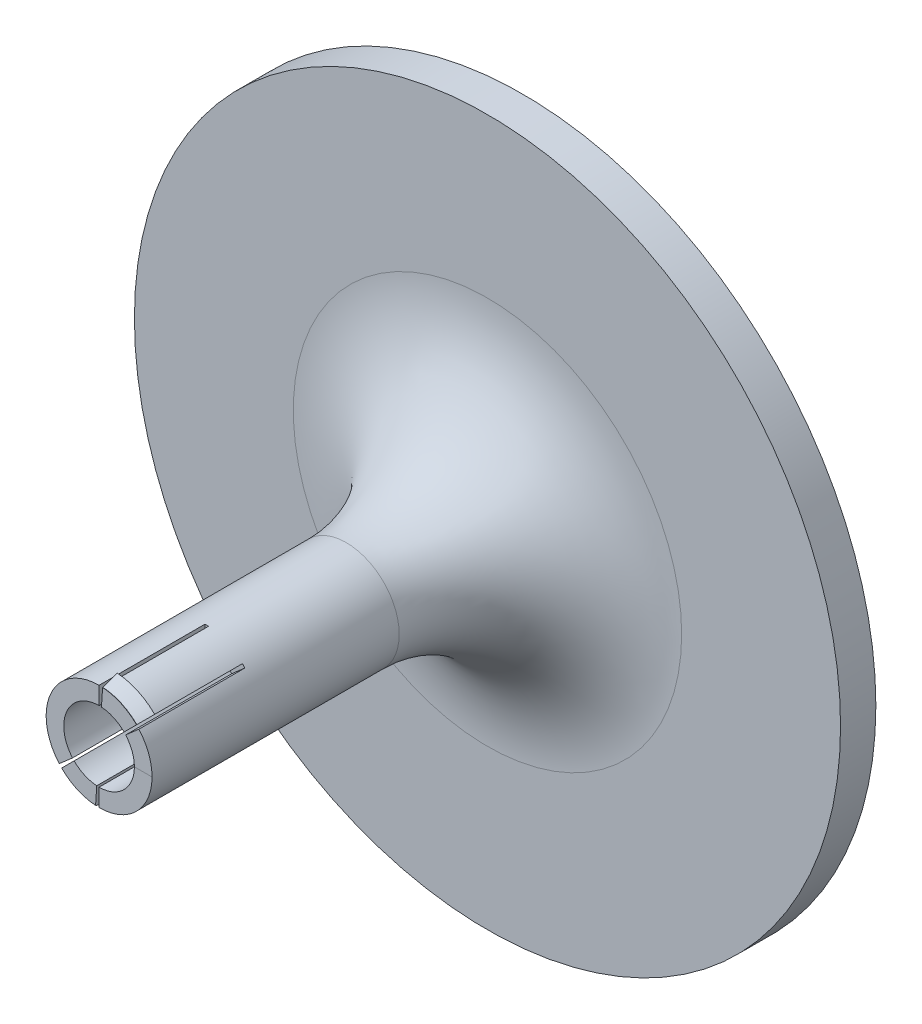
ISO-10303-21;
HEADER;
FILE_DESCRIPTION(('STEP AP214'),'2;1');
FILE_NAME('part.step','',(''),(''),'','','');
FILE_SCHEMA(('AUTOMOTIVE_DESIGN { 1 0 10303 214 1 1 1 1 }'));
ENDSEC;
DATA;
#1=APPLICATION_CONTEXT('core data for automotive mechanical design processes');
#2=APPLICATION_PROTOCOL_DEFINITION('international standard','automotive_design',2000,#1);
#3=PRODUCT_CONTEXT('',#1,'mechanical');
#4=PRODUCT('Part','Part','',(#3));
#5=PRODUCT_RELATED_PRODUCT_CATEGORY('part','',(#4));
#6=PRODUCT_DEFINITION_FORMATION('','',#4);
#7=PRODUCT_DEFINITION_CONTEXT('part definition',#1,'design');
#8=PRODUCT_DEFINITION('design','',#6,#7);
#9=PRODUCT_DEFINITION_SHAPE('','',#8);
#10=(LENGTH_UNIT() NAMED_UNIT(*) SI_UNIT(.MILLI.,.METRE.));
#11=(NAMED_UNIT(*) PLANE_ANGLE_UNIT() SI_UNIT($,.RADIAN.));
#12=(NAMED_UNIT(*) SI_UNIT($,.STERADIAN.) SOLID_ANGLE_UNIT());
#13=UNCERTAINTY_MEASURE_WITH_UNIT(LENGTH_MEASURE(1.E-05),#10,'distance_accuracy_value','');
#14=(GEOMETRIC_REPRESENTATION_CONTEXT(3) GLOBAL_UNCERTAINTY_ASSIGNED_CONTEXT((#13)) GLOBAL_UNIT_ASSIGNED_CONTEXT((#10,
#11,#12)) REPRESENTATION_CONTEXT('',''));
#15=CARTESIAN_POINT('',(0.,0.,0.));
#16=DIRECTION('',(0.,0.,1.));
#17=DIRECTION('',(1.,0.,0.));
#18=AXIS2_PLACEMENT_3D('',#15,#16,#17);
#19=CARTESIAN_POINT('',(0.,0.,0.));
#20=DIRECTION('',(0.,0.,1.));
#21=DIRECTION('',(1.,0.,0.));
#22=AXIS2_PLACEMENT_3D('',#19,#20,#21);
#23=CYLINDRICAL_SURFACE('',#22,7.5);
#24=CARTESIAN_POINT('',(0.,0.,-0.0406821281591772));
#25=DIRECTION('',(0.,0.,-1.));
#26=DIRECTION('',(-1.,0.,0.));
#27=AXIS2_PLACEMENT_3D('',#24,#25,#26);
#28=CIRCLE('',#27,7.5);
#29=CARTESIAN_POINT('',(0.498892578928304,7.48338868392456,-0.0406821281591772));
#30=VERTEX_POINT('',#29);
#31=CARTESIAN_POINT('',(5.3033008588991,5.30330085889912,-0.0406821281591779));
#32=VERTEX_POINT('',#31);
#33=EDGE_CURVE('E250',#30,#32,#28,.T.);
#34=ORIENTED_EDGE('',*,*,#33,.F.);
#35=DIRECTION('',(0.,0.,1.));
#36=VECTOR('',#35,1.);
#37=CARTESIAN_POINT('',(0.498892578928304,7.48338868392456,0.));
#38=LINE('',#37,#36);
#39=CARTESIAN_POINT('',(0.498892578928304,7.48338868392456,0.));
#40=VERTEX_POINT('',#39);
#41=EDGE_CURVE('E306',#40,#30,#38,.F.);
#42=ORIENTED_EDGE('',*,*,#41,.F.);
#43=CARTESIAN_POINT('',(0.,0.,0.));
#44=DIRECTION('',(0.,0.,1.));
#45=DIRECTION('',(1.,0.,0.));
#46=AXIS2_PLACEMENT_3D('',#43,#44,#45);
#47=CIRCLE('',#46,7.5);
#48=CARTESIAN_POINT('',(5.3033008588991,5.30330085889912,0.));
#49=VERTEX_POINT('',#48);
#50=EDGE_CURVE('E329',#49,#40,#47,.T.);
#51=ORIENTED_EDGE('',*,*,#50,.F.);
#52=DIRECTION('',(0.,0.,1.));
#53=VECTOR('',#52,1.);
#54=CARTESIAN_POINT('',(5.3033008588991,5.30330085889912,-15.));
#55=LINE('',#54,#53);
#56=EDGE_CURVE('E61',#32,#49,#55,.T.);
#57=ORIENTED_EDGE('',*,*,#56,.F.);
#58=EDGE_LOOP('',(#34,#42,#51,#57));
#59=FACE_BOUND('',#58,.T.);
#60=ADVANCED_FACE('F38',(#59),#23,.T.);
#61=CARTESIAN_POINT('',(0.,0.,0.));
#62=DIRECTION('',(0.,0.,1.));
#63=DIRECTION('',(1.,0.,0.));
#64=AXIS2_PLACEMENT_3D('',#61,#62,#63);
#65=PLANE('',#64);
#66=DIRECTION('',(-0.752576694706878,-0.658504607868518,0.));
#67=VECTOR('',#66,1.);
#68=CARTESIAN_POINT('',(0.,0.,0.));
#69=LINE('',#68,#67);
#70=CARTESIAN_POINT('',(-3.76288347353439,-3.29252303934259,0.));
#71=VERTEX_POINT('',#70);
#72=CARTESIAN_POINT('',(-5.64432521030158,-4.93878455901388,0.));
#73=VERTEX_POINT('',#72);
#74=EDGE_CURVE('E252',#71,#73,#69,.T.);
#75=ORIENTED_EDGE('',*,*,#74,.F.);
#76=CARTESIAN_POINT('',(0.,0.,0.));
#77=DIRECTION('',(0.,0.,1.));
#78=DIRECTION('',(1.,0.,0.));
#79=AXIS2_PLACEMENT_3D('',#76,#77,#78);
#80=CIRCLE('',#79,5.);
#81=CARTESIAN_POINT('',(0.,5.,0.));
#82=VERTEX_POINT('',#81);
#83=EDGE_CURVE('E319',#82,#71,#80,.T.);
#84=ORIENTED_EDGE('',*,*,#83,.F.);
#85=DIRECTION('',(0.,-1.,0.));
#86=VECTOR('',#85,1.);
#87=CARTESIAN_POINT('',(0.,0.,0.));
#88=LINE('',#87,#86);
#89=CARTESIAN_POINT('',(0.,7.5,0.));
#90=VERTEX_POINT('',#89);
#91=EDGE_CURVE('E292',#90,#82,#88,.T.);
#92=ORIENTED_EDGE('',*,*,#91,.F.);
#93=EDGE_CURVE('E331',#90,#73,#47,.T.);
#94=ORIENTED_EDGE('',*,*,#93,.T.);
#95=EDGE_LOOP('',(#75,#84,#92,#94));
#96=FACE_BOUND('',#95,.T.);
#97=ADVANCED_FACE('F430',(#96),#65,.T.);
#98=DIRECTION('',(0.707106781186546,0.707106781186549,0.));
#99=VECTOR('',#98,1.);
#100=CARTESIAN_POINT('',(0.,0.,0.));
#101=LINE('',#100,#99);
#102=CARTESIAN_POINT('',(-5.30330085889909,-5.30330085889911,0.));
#103=VERTEX_POINT('',#102);
#104=CARTESIAN_POINT('',(-3.53553390593273,-3.53553390593274,0.));
#105=VERTEX_POINT('',#104);
#106=EDGE_CURVE('E256',#103,#105,#101,.T.);
#107=ORIENTED_EDGE('',*,*,#106,.F.);
#108=CARTESIAN_POINT('',(-0.498892578928302,-7.48338868392456,0.));
#109=VERTEX_POINT('',#108);
#110=EDGE_CURVE('E330',#103,#109,#47,.T.);
#111=ORIENTED_EDGE('',*,*,#110,.T.);
#112=DIRECTION('',(-0.0665190105237739,-0.997785157856609,0.));
#113=VECTOR('',#112,1.);
#114=CARTESIAN_POINT('',(0.,0.,0.));
#115=LINE('',#114,#113);
#116=CARTESIAN_POINT('',(-0.33259505261887,-4.98892578928305,0.));
#117=VERTEX_POINT('',#116);
#118=EDGE_CURVE('E265',#117,#109,#115,.T.);
#119=ORIENTED_EDGE('',*,*,#118,.F.);
#120=EDGE_CURVE('E318',#105,#117,#80,.T.);
#121=ORIENTED_EDGE('',*,*,#120,.F.);
#122=EDGE_LOOP('',(#107,#111,#119,#121));
#123=FACE_BOUND('',#122,.T.);
#124=ADVANCED_FACE('F392',(#123),#65,.T.);
#125=DIRECTION('',(0.752576694706878,0.658504607868518,0.));
#126=VECTOR('',#125,1.);
#127=CARTESIAN_POINT('',(0.,0.,0.));
#128=LINE('',#127,#126);
#129=CARTESIAN_POINT('',(3.76288347353439,3.29252303934259,0.));
#130=VERTEX_POINT('',#129);
#131=CARTESIAN_POINT('',(5.64432521030158,4.93878455901389,0.));
#132=VERTEX_POINT('',#131);
#133=EDGE_CURVE('E275',#130,#132,#128,.T.);
#134=ORIENTED_EDGE('',*,*,#133,.F.);
#135=CARTESIAN_POINT('',(5.,0.,0.));
#136=VERTEX_POINT('',#135);
#137=EDGE_CURVE('E314',#136,#130,#80,.T.);
#138=ORIENTED_EDGE('',*,*,#137,.F.);
#139=DIRECTION('',(1.,0.,0.));
#140=VECTOR('',#139,1.);
#141=CARTESIAN_POINT('',(0.,0.,0.));
#142=LINE('',#141,#140);
#143=CARTESIAN_POINT('',(7.5,0.,0.));
#144=VERTEX_POINT('',#143);
#145=EDGE_CURVE('E349',#136,#144,#142,.T.);
#146=ORIENTED_EDGE('',*,*,#145,.T.);
#147=EDGE_CURVE('E326',#144,#132,#47,.T.);
#148=ORIENTED_EDGE('',*,*,#147,.T.);
#149=EDGE_LOOP('',(#134,#138,#146,#148));
#150=FACE_BOUND('',#149,.T.);
#151=ADVANCED_FACE('F451',(#150),#65,.T.);
#152=DIRECTION('',(0.,1.,0.));
#153=VECTOR('',#152,1.);
#154=CARTESIAN_POINT('',(0.,0.,0.));
#155=LINE('',#154,#153);
#156=CARTESIAN_POINT('',(0.,-7.5,0.));
#157=VERTEX_POINT('',#156);
#158=CARTESIAN_POINT('',(0.,-5.,0.));
#159=VERTEX_POINT('',#158);
#160=EDGE_CURVE('E270',#157,#159,#155,.T.);
#161=ORIENTED_EDGE('',*,*,#160,.F.);
#162=EDGE_CURVE('E352',#157,#144,#47,.T.);
#163=ORIENTED_EDGE('',*,*,#162,.T.);
#164=ORIENTED_EDGE('',*,*,#145,.F.);
#165=EDGE_CURVE('E309',#159,#136,#80,.T.);
#166=ORIENTED_EDGE('',*,*,#165,.F.);
#167=EDGE_LOOP('',(#161,#163,#164,#166));
#168=FACE_BOUND('',#167,.T.);
#169=ADVANCED_FACE('F446',(#168),#65,.T.);
#170=CARTESIAN_POINT('',(0.,0.,-2.));
#171=DIRECTION('',(0.,0.,1.));
#172=DIRECTION('',(-0.707106781186547,-0.707106781186548,0.));
#173=AXIS2_PLACEMENT_3D('',#170,#171,#172);
#174=CIRCLE('',#173,7.5);
#175=CARTESIAN_POINT('',(-5.30330085889909,-5.30330085889911,-2.));
#176=VERTEX_POINT('',#175);
#177=CARTESIAN_POINT('',(-0.498892578928304,-7.48338868392456,-2.));
#178=VERTEX_POINT('',#177);
#179=EDGE_CURVE('E53',#176,#178,#174,.T.);
#180=ORIENTED_EDGE('',*,*,#179,.F.);
#181=DIRECTION('',(0.,0.,1.));
#182=VECTOR('',#181,1.);
#183=CARTESIAN_POINT('',(-5.30330085889909,-5.30330085889911,-15.));
#184=LINE('',#183,#182);
#185=CARTESIAN_POINT('',(-5.30330085889909,-5.30330085889911,-15.));
#186=VERTEX_POINT('',#185);
#187=EDGE_CURVE('E263',#186,#176,#184,.T.);
#188=ORIENTED_EDGE('',*,*,#187,.F.);
#189=CARTESIAN_POINT('',(0.,0.,-15.));
#190=DIRECTION('',(0.,0.,1.));
#191=DIRECTION('',(1.,0.,0.));
#192=AXIS2_PLACEMENT_3D('',#189,#190,#191);
#193=CIRCLE('',#192,7.5);
#194=CARTESIAN_POINT('',(-5.64432521030158,-4.93878455901388,-15.));
#195=VERTEX_POINT('',#194);
#196=EDGE_CURVE('E255',#195,#186,#193,.T.);
#197=ORIENTED_EDGE('',*,*,#196,.F.);
#198=DIRECTION('',(0.,0.,1.));
#199=VECTOR('',#198,1.);
#200=CARTESIAN_POINT('',(-5.64432521030158,-4.93878455901388,-15.));
#201=LINE('',#200,#199);
#202=EDGE_CURVE('E260',#195,#73,#201,.T.);
#203=ORIENTED_EDGE('',*,*,#202,.T.);
#204=ORIENTED_EDGE('',*,*,#93,.F.);
#205=DIRECTION('',(0.,0.,1.));
#206=VECTOR('',#205,1.);
#207=CARTESIAN_POINT('',(0.,7.5,-15.));
#208=LINE('',#207,#206);
#209=CARTESIAN_POINT('',(0.,7.5,-15.));
#210=VERTEX_POINT('',#209);
#211=EDGE_CURVE('E299',#210,#90,#208,.T.);
#212=ORIENTED_EDGE('',*,*,#211,.F.);
#213=CARTESIAN_POINT('',(0.,0.,-15.));
#214=DIRECTION('',(0.,0.,-1.));
#215=DIRECTION('',(-1.,0.,0.));
#216=AXIS2_PLACEMENT_3D('',#213,#214,#215);
#217=CIRCLE('',#216,7.5);
#218=CARTESIAN_POINT('',(0.498892578928304,7.48338868392456,-15.));
#219=VERTEX_POINT('',#218);
#220=EDGE_CURVE('E303',#219,#210,#217,.F.);
#221=ORIENTED_EDGE('',*,*,#220,.F.);
#222=CARTESIAN_POINT('',(0.498892578928305,7.48338868392457,-1.99993101485482));
#223=VERTEX_POINT('',#222);
#224=EDGE_CURVE('E305',#223,#219,#38,.F.);
#225=ORIENTED_EDGE('',*,*,#224,.F.);
#226=CARTESIAN_POINT('',(0.,0.,-1.99993101485482));
#227=DIRECTION('',(0.,0.,1.));
#228=DIRECTION('',(0.707106781186546,0.707106781186549,0.));
#229=AXIS2_PLACEMENT_3D('',#226,#227,#228);
#230=CIRCLE('',#229,7.5);
#231=CARTESIAN_POINT('',(5.3033008588991,5.30330085889912,-1.99993101485482));
#232=VERTEX_POINT('',#231);
#233=EDGE_CURVE('E235',#232,#223,#230,.T.);
#234=ORIENTED_EDGE('',*,*,#233,.F.);
#235=CARTESIAN_POINT('',(5.3033008588991,5.30330085889912,-15.));
#236=VERTEX_POINT('',#235);
#237=EDGE_CURVE('E285',#236,#232,#55,.T.);
#238=ORIENTED_EDGE('',*,*,#237,.F.);
#239=CARTESIAN_POINT('',(0.,0.,-15.));
#240=DIRECTION('',(0.,0.,-1.));
#241=DIRECTION('',(-1.,0.,0.));
#242=AXIS2_PLACEMENT_3D('',#239,#240,#241);
#243=CIRCLE('',#242,7.5);
#244=CARTESIAN_POINT('',(5.64432521030158,4.93878455901388,-15.));
#245=VERTEX_POINT('',#244);
#246=EDGE_CURVE('E288',#245,#236,#243,.F.);
#247=ORIENTED_EDGE('',*,*,#246,.F.);
#248=DIRECTION('',(0.,0.,1.));
#249=VECTOR('',#248,1.);
#250=CARTESIAN_POINT('',(5.64432521030158,4.93878455901388,0.));
#251=LINE('',#250,#249);
#252=EDGE_CURVE('E290',#132,#245,#251,.F.);
#253=ORIENTED_EDGE('',*,*,#252,.F.);
#254=ORIENTED_EDGE('',*,*,#147,.F.);
#255=DIRECTION('',(0.,0.,-1.));
#256=VECTOR('',#255,1.);
#257=CARTESIAN_POINT('',(7.5,0.,-35.));
#258=LINE('',#257,#256);
#259=CARTESIAN_POINT('',(7.5,0.,-35.));
#260=VERTEX_POINT('',#259);
#261=EDGE_CURVE('E313',#144,#260,#258,.T.);
#262=ORIENTED_EDGE('',*,*,#261,.T.);
#263=CARTESIAN_POINT('',(0.,0.,-35.));
#264=DIRECTION('',(0.,0.,1.));
#265=DIRECTION('',(1.,0.,0.));
#266=AXIS2_PLACEMENT_3D('',#263,#264,#265);
#267=CIRCLE('',#266,7.5);
#268=EDGE_CURVE('E323',#260,#260,#267,.T.);
#269=ORIENTED_EDGE('',*,*,#268,.T.);
#270=ORIENTED_EDGE('',*,*,#261,.F.);
#271=ORIENTED_EDGE('',*,*,#162,.F.);
#272=DIRECTION('',(0.,0.,1.));
#273=VECTOR('',#272,1.);
#274=CARTESIAN_POINT('',(0.,-7.5,-15.));
#275=LINE('',#274,#273);
#276=CARTESIAN_POINT('',(0.,-7.5,-15.));
#277=VERTEX_POINT('',#276);
#278=EDGE_CURVE('E209',#277,#157,#275,.T.);
#279=ORIENTED_EDGE('',*,*,#278,.F.);
#280=CARTESIAN_POINT('',(0.,0.,-15.));
#281=DIRECTION('',(0.,0.,1.));
#282=DIRECTION('',(1.,0.,0.));
#283=AXIS2_PLACEMENT_3D('',#280,#281,#282);
#284=CIRCLE('',#283,7.5);
#285=CARTESIAN_POINT('',(-0.498892578928302,-7.48338868392456,-15.));
#286=VERTEX_POINT('',#285);
#287=EDGE_CURVE('E206',#286,#277,#284,.T.);
#288=ORIENTED_EDGE('',*,*,#287,.F.);
#289=DIRECTION('',(0.,0.,1.));
#290=VECTOR('',#289,1.);
#291=CARTESIAN_POINT('',(-0.498892578928302,-7.48338868392456,-15.));
#292=LINE('',#291,#290);
#293=EDGE_CURVE('E202',#286,#178,#292,.T.);
#294=ORIENTED_EDGE('',*,*,#293,.T.);
#295=EDGE_LOOP('',(#180,#188,#197,#203,#204,#212,#221,#225,#234,#238,#247,#253,#254,#262,#269,
#270,#271,#279,#288,#294));
#296=FACE_BOUND('',#295,.T.);
#297=ADVANCED_FACE('F204',(#296),#23,.T.);
#298=ORIENTED_EDGE('',*,*,#50,.T.);
#299=DIRECTION('',(0.0665190105237739,0.997785157856609,0.));
#300=VECTOR('',#299,1.);
#301=CARTESIAN_POINT('',(0.,0.,0.));
#302=LINE('',#301,#300);
#303=CARTESIAN_POINT('',(0.33259505261887,4.98892578928305,0.));
#304=VERTEX_POINT('',#303);
#305=EDGE_CURVE('E296',#304,#40,#302,.T.);
#306=ORIENTED_EDGE('',*,*,#305,.F.);
#307=CARTESIAN_POINT('',(3.53553390593273,3.53553390593274,0.));
#308=VERTEX_POINT('',#307);
#309=EDGE_CURVE('E317',#308,#304,#80,.T.);
#310=ORIENTED_EDGE('',*,*,#309,.F.);
#311=DIRECTION('',(-0.707106781186546,-0.707106781186549,0.));
#312=VECTOR('',#311,1.);
#313=CARTESIAN_POINT('',(0.,0.,0.));
#314=LINE('',#313,#312);
#315=EDGE_CURVE('E281',#49,#308,#314,.T.);
#316=ORIENTED_EDGE('',*,*,#315,.F.);
#317=EDGE_LOOP('',(#298,#306,#310,#316));
#318=FACE_BOUND('',#317,.T.);
#319=ADVANCED_FACE('F40',(#318),#65,.T.);
#320=CARTESIAN_POINT('',(0.,0.,-60.));
#321=DIRECTION('',(0.,0.,-1.));
#322=DIRECTION('',(-1.,0.,0.));
#323=AXIS2_PLACEMENT_3D('',#320,#321,#322);
#324=PLANE('',#323);
#325=CARTESIAN_POINT('',(0.,0.,-60.));
#326=DIRECTION('',(0.,0.,1.));
#327=DIRECTION('',(1.,0.,0.));
#328=AXIS2_PLACEMENT_3D('',#325,#326,#327);
#329=CIRCLE('',#328,5.);
#330=CARTESIAN_POINT('',(5.,0.,-60.));
#331=VERTEX_POINT('',#330);
#332=EDGE_CURVE('E310',#331,#331,#329,.T.);
#333=ORIENTED_EDGE('',*,*,#332,.T.);
#334=EDGE_LOOP('',(#333));
#335=FACE_BOUND('',#334,.T.);
#336=CARTESIAN_POINT('',(0.,0.,-60.));
#337=DIRECTION('',(0.,0.,1.));
#338=DIRECTION('',(1.,0.,0.));
#339=AXIS2_PLACEMENT_3D('',#336,#337,#338);
#340=CIRCLE('',#339,50.);
#341=CARTESIAN_POINT('',(50.,0.,-60.));
#342=VERTEX_POINT('',#341);
#343=EDGE_CURVE('E341',#342,#342,#340,.T.);
#344=ORIENTED_EDGE('',*,*,#343,.F.);
#345=EDGE_LOOP('',(#344));
#346=FACE_BOUND('',#345,.T.);
#347=ADVANCED_FACE('F469',(#335,#346),#324,.T.);
#348=CARTESIAN_POINT('',(0.,0.,0.));
#349=DIRECTION('',(0.,0.,1.));
#350=DIRECTION('',(1.,0.,0.));
#351=AXIS2_PLACEMENT_3D('',#348,#349,#350);
#352=CYLINDRICAL_SURFACE('',#351,50.);
#353=DIRECTION('',(0.,0.,-1.));
#354=VECTOR('',#353,1.);
#355=CARTESIAN_POINT('',(50.,0.,-60.));
#356=LINE('',#355,#354);
#357=CARTESIAN_POINT('',(50.,0.,-55.));
#358=VERTEX_POINT('',#357);
#359=EDGE_CURVE('E339',#358,#342,#356,.T.);
#360=ORIENTED_EDGE('',*,*,#359,.F.);
#361=CARTESIAN_POINT('',(0.,0.,-55.));
#362=DIRECTION('',(0.,0.,1.));
#363=DIRECTION('',(1.,0.,0.));
#364=AXIS2_PLACEMENT_3D('',#361,#362,#363);
#365=CIRCLE('',#364,50.);
#366=EDGE_CURVE('E336',#358,#358,#365,.T.);
#367=ORIENTED_EDGE('',*,*,#366,.F.);
#368=ORIENTED_EDGE('',*,*,#359,.T.);
#369=ORIENTED_EDGE('',*,*,#343,.T.);
#370=EDGE_LOOP('',(#360,#367,#368,#369));
#371=FACE_BOUND('',#370,.T.);
#372=ADVANCED_FACE('F465',(#371),#352,.T.);
#373=CARTESIAN_POINT('',(50.,0.,-55.));
#374=DIRECTION('',(0.,0.,1.));
#375=DIRECTION('',(1.,0.,0.));
#376=AXIS2_PLACEMENT_3D('',#373,#374,#375);
#377=PLANE('',#376);
#378=ORIENTED_EDGE('',*,*,#366,.T.);
#379=EDGE_LOOP('',(#378));
#380=FACE_BOUND('',#379,.T.);
#381=CARTESIAN_POINT('',(0.,0.,-55.));
#382=DIRECTION('',(0.,0.,1.));
#383=DIRECTION('',(1.,0.,0.));
#384=AXIS2_PLACEMENT_3D('',#381,#382,#383);
#385=CIRCLE('',#384,27.5);
#386=CARTESIAN_POINT('',(27.5,0.,-55.));
#387=VERTEX_POINT('',#386);
#388=EDGE_CURVE('E325',#387,#387,#385,.T.);
#389=ORIENTED_EDGE('',*,*,#388,.F.);
#390=EDGE_LOOP('',(#389));
#391=FACE_BOUND('',#390,.T.);
#392=ADVANCED_FACE('F461',(#380,#391),#377,.T.);
#393=CARTESIAN_POINT('',(0.,0.,-35.));
#394=DIRECTION('',(0.,0.,1.));
#395=DIRECTION('',(1.,0.,0.));
#396=AXIS2_PLACEMENT_3D('',#393,#394,#395);
#397=TOROIDAL_SURFACE('',#396,27.5,20.);
#398=CARTESIAN_POINT('',(27.5,0.,-35.));
#399=DIRECTION('',(0.,-1.,0.));
#400=DIRECTION('',(0.,0.,1.));
#401=AXIS2_PLACEMENT_3D('',#398,#399,#400);
#402=CIRCLE('',#401,20.);
#403=EDGE_CURVE('E322',#260,#387,#402,.T.);
#404=ORIENTED_EDGE('',*,*,#403,.F.);
#405=ORIENTED_EDGE('',*,*,#268,.F.);
#406=ORIENTED_EDGE('',*,*,#403,.T.);
#407=ORIENTED_EDGE('',*,*,#388,.T.);
#408=EDGE_LOOP('',(#404,#405,#406,#407));
#409=FACE_BOUND('',#408,.T.);
#410=ADVANCED_FACE('F457',(#409),#397,.F.);
#411=CARTESIAN_POINT('',(0.,0.,-60.));
#412=DIRECTION('',(0.,0.,1.));
#413=DIRECTION('',(1.,0.,0.));
#414=AXIS2_PLACEMENT_3D('',#411,#412,#413);
#415=CYLINDRICAL_SURFACE('',#414,5.);
#416=ORIENTED_EDGE('',*,*,#83,.T.);
#417=DIRECTION('',(0.,0.,1.));
#418=VECTOR('',#417,1.);
#419=CARTESIAN_POINT('',(-3.76288347353439,-3.29252303934259,-60.));
#420=LINE('',#419,#418);
#421=CARTESIAN_POINT('',(-3.76288347353439,-3.29252303934259,-15.));
#422=VERTEX_POINT('',#421);
#423=EDGE_CURVE('E11',#71,#422,#420,.F.);
#424=ORIENTED_EDGE('',*,*,#423,.T.);
#425=CARTESIAN_POINT('',(0.,0.,-15.));
#426=DIRECTION('',(0.,0.,1.));
#427=DIRECTION('',(1.,0.,0.));
#428=AXIS2_PLACEMENT_3D('',#425,#426,#427);
#429=CIRCLE('',#428,5.);
#430=CARTESIAN_POINT('',(-3.53553390593273,-3.53553390593274,-15.));
#431=VERTEX_POINT('',#430);
#432=EDGE_CURVE('E378',#431,#422,#429,.F.);
#433=ORIENTED_EDGE('',*,*,#432,.F.);
#434=DIRECTION('',(0.,0.,1.));
#435=VECTOR('',#434,1.);
#436=CARTESIAN_POINT('',(-3.53553390593273,-3.53553390593274,-60.));
#437=LINE('',#436,#435);
#438=EDGE_CURVE('E46',#431,#105,#437,.T.);
#439=ORIENTED_EDGE('',*,*,#438,.T.);
#440=ORIENTED_EDGE('',*,*,#120,.T.);
#441=DIRECTION('',(0.,0.,1.));
#442=VECTOR('',#441,1.);
#443=CARTESIAN_POINT('',(-0.33259505261887,-4.98892578928305,-60.));
#444=LINE('',#443,#442);
#445=CARTESIAN_POINT('',(-0.33259505261887,-4.98892578928305,-15.));
#446=VERTEX_POINT('',#445);
#447=EDGE_CURVE('E375',#117,#446,#444,.F.);
#448=ORIENTED_EDGE('',*,*,#447,.T.);
#449=CARTESIAN_POINT('',(0.,0.,-15.));
#450=DIRECTION('',(0.,0.,1.));
#451=DIRECTION('',(1.,0.,0.));
#452=AXIS2_PLACEMENT_3D('',#449,#450,#451);
#453=CIRCLE('',#452,5.);
#454=CARTESIAN_POINT('',(0.,-5.,-15.));
#455=VERTEX_POINT('',#454);
#456=EDGE_CURVE('E370',#455,#446,#453,.F.);
#457=ORIENTED_EDGE('',*,*,#456,.F.);
#458=DIRECTION('',(0.,0.,1.));
#459=VECTOR('',#458,1.);
#460=CARTESIAN_POINT('',(0.,-5.,-60.));
#461=LINE('',#460,#459);
#462=EDGE_CURVE('E372',#455,#159,#461,.T.);
#463=ORIENTED_EDGE('',*,*,#462,.T.);
#464=ORIENTED_EDGE('',*,*,#165,.T.);
#465=ORIENTED_EDGE('',*,*,#137,.T.);
#466=DIRECTION('',(0.,0.,1.));
#467=VECTOR('',#466,1.);
#468=CARTESIAN_POINT('',(3.76288347353439,3.29252303934259,-60.));
#469=LINE('',#468,#467);
#470=CARTESIAN_POINT('',(3.76288347353439,3.29252303934259,-15.));
#471=VERTEX_POINT('',#470);
#472=EDGE_CURVE('E367',#130,#471,#469,.F.);
#473=ORIENTED_EDGE('',*,*,#472,.T.);
#474=CARTESIAN_POINT('',(0.,0.,-15.));
#475=DIRECTION('',(0.,0.,-1.));
#476=DIRECTION('',(-1.,0.,0.));
#477=AXIS2_PLACEMENT_3D('',#474,#475,#476);
#478=CIRCLE('',#477,5.);
#479=CARTESIAN_POINT('',(3.53553390593273,3.53553390593274,-15.));
#480=VERTEX_POINT('',#479);
#481=EDGE_CURVE('E361',#471,#480,#478,.F.);
#482=ORIENTED_EDGE('',*,*,#481,.T.);
#483=DIRECTION('',(0.,0.,1.));
#484=VECTOR('',#483,1.);
#485=CARTESIAN_POINT('',(3.53553390593273,3.53553390593274,-60.));
#486=LINE('',#485,#484);
#487=EDGE_CURVE('E364',#480,#308,#486,.T.);
#488=ORIENTED_EDGE('',*,*,#487,.T.);
#489=ORIENTED_EDGE('',*,*,#309,.T.);
#490=DIRECTION('',(0.,0.,1.));
#491=VECTOR('',#490,1.);
#492=CARTESIAN_POINT('',(0.33259505261887,4.98892578928305,-60.));
#493=LINE('',#492,#491);
#494=CARTESIAN_POINT('',(0.33259505261887,4.98892578928305,-15.));
#495=VERTEX_POINT('',#494);
#496=EDGE_CURVE('E355',#304,#495,#493,.F.);
#497=ORIENTED_EDGE('',*,*,#496,.T.);
#498=CARTESIAN_POINT('',(0.,0.,-15.));
#499=DIRECTION('',(0.,0.,-1.));
#500=DIRECTION('',(-1.,0.,0.));
#501=AXIS2_PLACEMENT_3D('',#498,#499,#500);
#502=CIRCLE('',#501,5.);
#503=CARTESIAN_POINT('',(0.,5.,-15.));
#504=VERTEX_POINT('',#503);
#505=EDGE_CURVE('E346',#495,#504,#502,.F.);
#506=ORIENTED_EDGE('',*,*,#505,.T.);
#507=DIRECTION('',(0.,0.,1.));
#508=VECTOR('',#507,1.);
#509=CARTESIAN_POINT('',(0.,5.,-60.));
#510=LINE('',#509,#508);
#511=EDGE_CURVE('E358',#504,#82,#510,.T.);
#512=ORIENTED_EDGE('',*,*,#511,.T.);
#513=EDGE_LOOP('',(#416,#424,#433,#439,#440,#448,#457,#463,#464,#465,#473,#482,#488,#489,#497,
#506,#512));
#514=FACE_BOUND('',#513,.T.);
#515=ORIENTED_EDGE('',*,*,#332,.F.);
#516=EDGE_LOOP('',(#515));
#517=FACE_BOUND('',#516,.T.);
#518=ADVANCED_FACE('F385',(#514,#517),#415,.F.);
#519=CARTESIAN_POINT('',(0.,0.,-15.));
#520=DIRECTION('',(-1.,0.,0.));
#521=DIRECTION('',(0.,0.,1.));
#522=AXIS2_PLACEMENT_3D('',#519,#520,#521);
#523=PLANE('',#522);
#524=DIRECTION('',(0.,-1.,0.));
#525=VECTOR('',#524,1.);
#526=CARTESIAN_POINT('',(0.,0.,-15.));
#527=LINE('',#526,#525);
#528=EDGE_CURVE('E293',#210,#504,#527,.T.);
#529=ORIENTED_EDGE('',*,*,#528,.F.);
#530=ORIENTED_EDGE('',*,*,#211,.T.);
#531=ORIENTED_EDGE('',*,*,#91,.T.);
#532=ORIENTED_EDGE('',*,*,#511,.F.);
#533=EDGE_LOOP('',(#529,#530,#531,#532));
#534=FACE_BOUND('',#533,.T.);
#535=ADVANCED_FACE('F425',(#534),#523,.F.);
#536=CARTESIAN_POINT('',(0.,0.,-15.));
#537=DIRECTION('',(0.997785157856609,-0.0665190105237739,0.));
#538=DIRECTION('',(0.0665190105237739,0.997785157856609,0.));
#539=AXIS2_PLACEMENT_3D('',#536,#537,#538);
#540=PLANE('',#539);
#541=DIRECTION('',(-0.066519010523774,-0.997785157856609,0.));
#542=VECTOR('',#541,1.);
#543=CARTESIAN_POINT('',(0.498892578928305,7.48338868392457,-1.99993101485482));
#544=LINE('',#543,#542);
#545=CARTESIAN_POINT('',(0.552107787347324,8.28161681020985,-1.99993101485482));
#546=VERTEX_POINT('',#545);
#547=EDGE_CURVE('E245',#546,#223,#544,.T.);
#548=ORIENTED_EDGE('',*,*,#547,.T.);
#549=ORIENTED_EDGE('',*,*,#224,.T.);
#550=DIRECTION('',(0.0665190105237739,0.997785157856609,0.));
#551=VECTOR('',#550,1.);
#552=CARTESIAN_POINT('',(0.,0.,-15.));
#553=LINE('',#552,#551);
#554=EDGE_CURVE('E295',#495,#219,#553,.T.);
#555=ORIENTED_EDGE('',*,*,#554,.F.);
#556=ORIENTED_EDGE('',*,*,#496,.F.);
#557=ORIENTED_EDGE('',*,*,#305,.T.);
#558=ORIENTED_EDGE('',*,*,#41,.T.);
#559=DIRECTION('',(0.025145594318371,0.377183914775564,-0.92579695048156));
#560=VECTOR('',#559,1.);
#561=CARTESIAN_POINT('',(0.552107787347324,8.28161681020985,-1.99993101485482));
#562=LINE('',#561,#560);
#563=EDGE_CURVE('E238',#30,#546,#562,.T.);
#564=ORIENTED_EDGE('',*,*,#563,.T.);
#565=EDGE_LOOP('',(#548,#549,#555,#556,#557,#558,#564));
#566=FACE_BOUND('',#565,.T.);
#567=ADVANCED_FACE('F404',(#566),#540,.F.);
#568=CARTESIAN_POINT('',(0.,0.,-15.));
#569=DIRECTION('',(0.,0.,-1.));
#570=DIRECTION('',(-1.,0.,0.));
#571=AXIS2_PLACEMENT_3D('',#568,#569,#570);
#572=PLANE('',#571);
#573=ORIENTED_EDGE('',*,*,#220,.T.);
#574=ORIENTED_EDGE('',*,*,#528,.T.);
#575=ORIENTED_EDGE('',*,*,#505,.F.);
#576=ORIENTED_EDGE('',*,*,#554,.T.);
#577=EDGE_LOOP('',(#573,#574,#575,#576));
#578=FACE_BOUND('',#577,.T.);
#579=ADVANCED_FACE('F418',(#578),#572,.F.);
#580=CARTESIAN_POINT('',(0.,0.,-15.));
#581=DIRECTION('',(0.658504607868518,-0.752576694706878,0.));
#582=DIRECTION('',(0.752576694706878,0.658504607868518,0.));
#583=AXIS2_PLACEMENT_3D('',#580,#581,#582);
#584=PLANE('',#583);
#585=ORIENTED_EDGE('',*,*,#252,.T.);
#586=DIRECTION('',(0.752576694706878,0.658504607868518,0.));
#587=VECTOR('',#586,1.);
#588=CARTESIAN_POINT('',(0.,0.,-15.));
#589=LINE('',#588,#587);
#590=EDGE_CURVE('E277',#471,#245,#589,.T.);
#591=ORIENTED_EDGE('',*,*,#590,.F.);
#592=ORIENTED_EDGE('',*,*,#472,.F.);
#593=ORIENTED_EDGE('',*,*,#133,.T.);
#594=EDGE_LOOP('',(#585,#591,#592,#593));
#595=FACE_BOUND('',#594,.T.);
#596=ADVANCED_FACE('F565',(#595),#584,.F.);
#597=CARTESIAN_POINT('',(0.,0.,-15.));
#598=DIRECTION('',(-0.707106781186549,0.707106781186546,0.));
#599=DIRECTION('',(-0.707106781186546,-0.707106781186549,0.));
#600=AXIS2_PLACEMENT_3D('',#597,#598,#599);
#601=PLANE('',#600);
#602=ORIENTED_EDGE('',*,*,#237,.T.);
#603=DIRECTION('',(-0.707106781186546,-0.707106781186549,0.));
#604=VECTOR('',#603,1.);
#605=CARTESIAN_POINT('',(5.3033008588991,5.30330085889911,-1.99993101485482));
#606=LINE('',#605,#604);
#607=CARTESIAN_POINT('',(5.86898628384833,5.86898628384835,-1.99993101485482));
#608=VERTEX_POINT('',#607);
#609=EDGE_CURVE('E239',#608,#232,#606,.T.);
#610=ORIENTED_EDGE('',*,*,#609,.F.);
#611=DIRECTION('',(0.267301334152154,0.267301334152155,-0.92579695048156));
#612=VECTOR('',#611,1.);
#613=CARTESIAN_POINT('',(5.86898628384833,5.86898628384835,-1.99993101485482));
#614=LINE('',#613,#612);
#615=EDGE_CURVE('E221',#32,#608,#614,.T.);
#616=ORIENTED_EDGE('',*,*,#615,.F.);
#617=ORIENTED_EDGE('',*,*,#56,.T.);
#618=ORIENTED_EDGE('',*,*,#315,.T.);
#619=ORIENTED_EDGE('',*,*,#487,.F.);
#620=DIRECTION('',(-0.707106781186546,-0.707106781186549,0.));
#621=VECTOR('',#620,1.);
#622=CARTESIAN_POINT('',(0.,0.,-15.));
#623=LINE('',#622,#621);
#624=EDGE_CURVE('E280',#236,#480,#623,.T.);
#625=ORIENTED_EDGE('',*,*,#624,.F.);
#626=EDGE_LOOP('',(#602,#610,#616,#617,#618,#619,#625));
#627=FACE_BOUND('',#626,.T.);
#628=ADVANCED_FACE('F560',(#627),#601,.F.);
#629=CARTESIAN_POINT('',(0.,0.,-15.));
#630=DIRECTION('',(0.,0.,-1.));
#631=DIRECTION('',(-1.,0.,0.));
#632=AXIS2_PLACEMENT_3D('',#629,#630,#631);
#633=PLANE('',#632);
#634=ORIENTED_EDGE('',*,*,#246,.T.);
#635=ORIENTED_EDGE('',*,*,#624,.T.);
#636=ORIENTED_EDGE('',*,*,#481,.F.);
#637=ORIENTED_EDGE('',*,*,#590,.T.);
#638=EDGE_LOOP('',(#634,#635,#636,#637));
#639=FACE_BOUND('',#638,.T.);
#640=ADVANCED_FACE('F564',(#639),#633,.F.);
#641=CARTESIAN_POINT('',(0.,0.,-15.));
#642=DIRECTION('',(-0.997785157856609,0.0665190105237739,0.));
#643=DIRECTION('',(-0.0665190105237739,-0.997785157856609,0.));
#644=AXIS2_PLACEMENT_3D('',#641,#642,#643);
#645=PLANE('',#644);
#646=ORIENTED_EDGE('',*,*,#118,.T.);
#647=DIRECTION('',(-0.0247045403088301,-0.370568104632452,-0.92847669088526));
#648=VECTOR('',#647,1.);
#649=CARTESIAN_POINT('',(-0.552107787347324,-8.28161681020985,-2.));
#650=LINE('',#649,#648);
#651=CARTESIAN_POINT('',(-0.552107787347323,-8.28161681020985,-2.));
#652=VERTEX_POINT('',#651);
#653=EDGE_CURVE('E217',#109,#652,#650,.T.);
#654=ORIENTED_EDGE('',*,*,#653,.T.);
#655=DIRECTION('',(0.066519010523774,0.997785157856609,0.));
#656=VECTOR('',#655,1.);
#657=CARTESIAN_POINT('',(-0.498892578928304,-7.48338868392456,-2.));
#658=LINE('',#657,#656);
#659=EDGE_CURVE('E213',#652,#178,#658,.T.);
#660=ORIENTED_EDGE('',*,*,#659,.T.);
#661=ORIENTED_EDGE('',*,*,#293,.F.);
#662=DIRECTION('',(-0.0665190105237739,-0.997785157856609,0.));
#663=VECTOR('',#662,1.);
#664=CARTESIAN_POINT('',(0.,0.,-15.));
#665=LINE('',#664,#663);
#666=EDGE_CURVE('E268',#446,#286,#665,.T.);
#667=ORIENTED_EDGE('',*,*,#666,.F.);
#668=ORIENTED_EDGE('',*,*,#447,.F.);
#669=EDGE_LOOP('',(#646,#654,#660,#661,#667,#668));
#670=FACE_BOUND('',#669,.T.);
#671=ADVANCED_FACE('F215',(#670),#645,.F.);
#672=CARTESIAN_POINT('',(0.,0.,-15.));
#673=DIRECTION('',(1.,0.,0.));
#674=DIRECTION('',(0.,0.,-1.));
#675=AXIS2_PLACEMENT_3D('',#672,#673,#674);
#676=PLANE('',#675);
#677=DIRECTION('',(0.,1.,0.));
#678=VECTOR('',#677,1.);
#679=CARTESIAN_POINT('',(0.,0.,-15.));
#680=LINE('',#679,#678);
#681=EDGE_CURVE('E210',#277,#455,#680,.T.);
#682=ORIENTED_EDGE('',*,*,#681,.F.);
#683=ORIENTED_EDGE('',*,*,#278,.T.);
#684=ORIENTED_EDGE('',*,*,#160,.T.);
#685=ORIENTED_EDGE('',*,*,#462,.F.);
#686=EDGE_LOOP('',(#682,#683,#684,#685));
#687=FACE_BOUND('',#686,.T.);
#688=ADVANCED_FACE('F617',(#687),#676,.F.);
#689=CARTESIAN_POINT('',(0.,0.,-15.));
#690=DIRECTION('',(0.,0.,1.));
#691=DIRECTION('',(1.,0.,0.));
#692=AXIS2_PLACEMENT_3D('',#689,#690,#691);
#693=PLANE('',#692);
#694=ORIENTED_EDGE('',*,*,#456,.T.);
#695=ORIENTED_EDGE('',*,*,#666,.T.);
#696=ORIENTED_EDGE('',*,*,#287,.T.);
#697=ORIENTED_EDGE('',*,*,#681,.T.);
#698=EDGE_LOOP('',(#694,#695,#696,#697));
#699=FACE_BOUND('',#698,.T.);
#700=ADVANCED_FACE('F508',(#699),#693,.T.);
#701=CARTESIAN_POINT('',(0.,0.,-15.));
#702=DIRECTION('',(-0.658504607868518,0.752576694706878,0.));
#703=DIRECTION('',(-0.752576694706878,-0.658504607868518,0.));
#704=AXIS2_PLACEMENT_3D('',#701,#702,#703);
#705=PLANE('',#704);
#706=ORIENTED_EDGE('',*,*,#74,.T.);
#707=ORIENTED_EDGE('',*,*,#202,.F.);
#708=DIRECTION('',(-0.752576694706878,-0.658504607868518,0.));
#709=VECTOR('',#708,1.);
#710=CARTESIAN_POINT('',(0.,0.,-15.));
#711=LINE('',#710,#709);
#712=EDGE_CURVE('E253',#422,#195,#711,.T.);
#713=ORIENTED_EDGE('',*,*,#712,.F.);
#714=ORIENTED_EDGE('',*,*,#423,.F.);
#715=EDGE_LOOP('',(#706,#707,#713,#714));
#716=FACE_BOUND('',#715,.T.);
#717=ADVANCED_FACE('F433',(#716),#705,.F.);
#718=CARTESIAN_POINT('',(0.,0.,-15.));
#719=DIRECTION('',(0.707106781186549,-0.707106781186546,0.));
#720=DIRECTION('',(0.707106781186546,0.707106781186549,0.));
#721=AXIS2_PLACEMENT_3D('',#718,#719,#720);
#722=PLANE('',#721);
#723=DIRECTION('',(0.707106781186546,0.707106781186549,0.));
#724=VECTOR('',#723,1.);
#725=CARTESIAN_POINT('',(0.,0.,-15.));
#726=LINE('',#725,#724);
#727=EDGE_CURVE('E258',#186,#431,#726,.T.);
#728=ORIENTED_EDGE('',*,*,#727,.F.);
#729=ORIENTED_EDGE('',*,*,#187,.T.);
#730=DIRECTION('',(0.707106781186547,0.707106781186548,0.));
#731=VECTOR('',#730,1.);
#732=CARTESIAN_POINT('',(-5.3033008588991,-5.30330085889911,-2.));
#733=LINE('',#732,#731);
#734=CARTESIAN_POINT('',(-5.86898628384834,-5.86898628384835,-2.));
#735=VERTEX_POINT('',#734);
#736=EDGE_CURVE('E226',#735,#176,#733,.T.);
#737=ORIENTED_EDGE('',*,*,#736,.F.);
#738=DIRECTION('',(-0.262612865719445,-0.262612865719445,-0.92847669088526));
#739=VECTOR('',#738,1.);
#740=CARTESIAN_POINT('',(-5.86898628384834,-5.86898628384835,-2.));
#741=LINE('',#740,#739);
#742=EDGE_CURVE('E229',#103,#735,#741,.T.);
#743=ORIENTED_EDGE('',*,*,#742,.F.);
#744=ORIENTED_EDGE('',*,*,#106,.T.);
#745=ORIENTED_EDGE('',*,*,#438,.F.);
#746=EDGE_LOOP('',(#728,#729,#737,#743,#744,#745));
#747=FACE_BOUND('',#746,.T.);
#748=ADVANCED_FACE('F438',(#747),#722,.F.);
#749=CARTESIAN_POINT('',(0.,0.,-15.));
#750=DIRECTION('',(0.,0.,1.));
#751=DIRECTION('',(1.,0.,0.));
#752=AXIS2_PLACEMENT_3D('',#749,#750,#751);
#753=PLANE('',#752);
#754=ORIENTED_EDGE('',*,*,#432,.T.);
#755=ORIENTED_EDGE('',*,*,#712,.T.);
#756=ORIENTED_EDGE('',*,*,#196,.T.);
#757=ORIENTED_EDGE('',*,*,#727,.T.);
#758=EDGE_LOOP('',(#754,#755,#756,#757));
#759=FACE_BOUND('',#758,.T.);
#760=ADVANCED_FACE('F437',(#759),#753,.T.);
#761=CARTESIAN_POINT('',(0.,0.,0.));
#762=DIRECTION('',(0.,0.,-1.));
#763=DIRECTION('',(-1.,0.,0.));
#764=AXIS2_PLACEMENT_3D('',#761,#762,#763);
#765=CONICAL_SURFACE('',#764,7.48338868392456,0.387657929328602);
#766=ORIENTED_EDGE('',*,*,#563,.F.);
#767=ORIENTED_EDGE('',*,*,#33,.T.);
#768=ORIENTED_EDGE('',*,*,#615,.T.);
#769=CARTESIAN_POINT('',(0.,0.,-1.99993101485482));
#770=DIRECTION('',(0.,0.,1.));
#771=DIRECTION('',(0.707106781186546,0.707106781186549,0.));
#772=AXIS2_PLACEMENT_3D('',#769,#770,#771);
#773=CIRCLE('',#772,8.3);
#774=EDGE_CURVE('E242',#608,#546,#773,.T.);
#775=ORIENTED_EDGE('',*,*,#774,.T.);
#776=EDGE_LOOP('',(#766,#767,#768,#775));
#777=FACE_BOUND('',#776,.T.);
#778=ADVANCED_FACE('F410',(#777),#765,.T.);
#779=CARTESIAN_POINT('',(5.3033008588991,5.30330085889911,-1.99993101485482));
#780=DIRECTION('',(0.,0.,-1.));
#781=DIRECTION('',(-1.,0.,0.));
#782=AXIS2_PLACEMENT_3D('',#779,#780,#781);
#783=PLANE('',#782);
#784=ORIENTED_EDGE('',*,*,#547,.F.);
#785=ORIENTED_EDGE('',*,*,#774,.F.);
#786=ORIENTED_EDGE('',*,*,#609,.T.);
#787=ORIENTED_EDGE('',*,*,#233,.T.);
#788=EDGE_LOOP('',(#784,#785,#786,#787));
#789=FACE_BOUND('',#788,.T.);
#790=ADVANCED_FACE('F415',(#789),#783,.T.);
#791=CARTESIAN_POINT('',(0.,0.,0.));
#792=DIRECTION('',(0.,0.,-1.));
#793=DIRECTION('',(-1.,0.,0.));
#794=AXIS2_PLACEMENT_3D('',#791,#792,#793);
#795=CONICAL_SURFACE('',#794,7.5,0.380506377112364);
#796=CARTESIAN_POINT('',(0.,0.,-2.));
#797=DIRECTION('',(0.,0.,1.));
#798=DIRECTION('',(-0.707106781186547,-0.707106781186548,0.));
#799=AXIS2_PLACEMENT_3D('',#796,#797,#798);
#800=CIRCLE('',#799,8.3);
#801=EDGE_CURVE('E222',#735,#652,#800,.T.);
#802=ORIENTED_EDGE('',*,*,#801,.T.);
#803=ORIENTED_EDGE('',*,*,#653,.F.);
#804=ORIENTED_EDGE('',*,*,#110,.F.);
#805=ORIENTED_EDGE('',*,*,#742,.T.);
#806=EDGE_LOOP('',(#802,#803,#804,#805));
#807=FACE_BOUND('',#806,.T.);
#808=ADVANCED_FACE('F441',(#807),#795,.T.);
#809=CARTESIAN_POINT('',(-5.3033008588991,-5.30330085889911,-2.));
#810=DIRECTION('',(0.,0.,-1.));
#811=DIRECTION('',(-1.,0.,0.));
#812=AXIS2_PLACEMENT_3D('',#809,#810,#811);
#813=PLANE('',#812);
#814=ORIENTED_EDGE('',*,*,#659,.F.);
#815=ORIENTED_EDGE('',*,*,#801,.F.);
#816=ORIENTED_EDGE('',*,*,#736,.T.);
#817=ORIENTED_EDGE('',*,*,#179,.T.);
#818=EDGE_LOOP('',(#814,#815,#816,#817));
#819=FACE_BOUND('',#818,.T.);
#820=ADVANCED_FACE('F225',(#819),#813,.T.);
#821=CLOSED_SHELL('',(#60,#97,#124,#151,#169,#297,#319,#347,#372,#392,#410,#518,#535,#567,#579,
#596,#628,#640,#671,#688,#700,#717,#748,#760,#778,#790,#808,#820));
#822=MANIFOLD_SOLID_BREP('B2',#821);
#823=ADVANCED_BREP_SHAPE_REPRESENTATION('',(#18,#822),#14);
#824=SHAPE_DEFINITION_REPRESENTATION(#9,#823);
ENDSEC;
END-ISO-10303-21;
